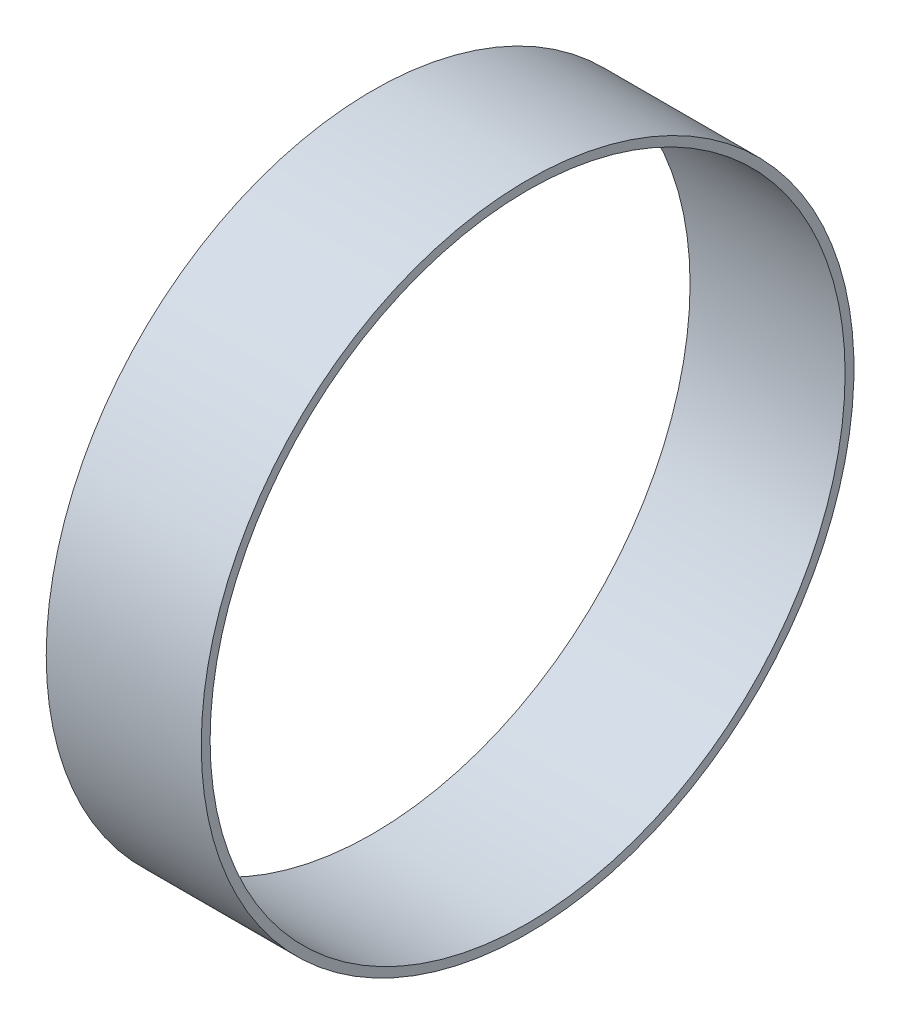
ISO-10303-21;
HEADER;
FILE_DESCRIPTION(('STEP AP214'),'2;1');
FILE_NAME('part.step','',(''),(''),'','','');
FILE_SCHEMA(('AUTOMOTIVE_DESIGN { 1 0 10303 214 1 1 1 1 }'));
ENDSEC;
DATA;
#1=APPLICATION_CONTEXT('core data for automotive mechanical design processes');
#2=APPLICATION_PROTOCOL_DEFINITION('international standard','automotive_design',2000,#1);
#3=PRODUCT_CONTEXT('',#1,'mechanical');
#4=PRODUCT('Part','Part','',(#3));
#5=PRODUCT_RELATED_PRODUCT_CATEGORY('part','',(#4));
#6=PRODUCT_DEFINITION_FORMATION('','',#4);
#7=PRODUCT_DEFINITION_CONTEXT('part definition',#1,'design');
#8=PRODUCT_DEFINITION('design','',#6,#7);
#9=PRODUCT_DEFINITION_SHAPE('','',#8);
#10=(LENGTH_UNIT() NAMED_UNIT(*) SI_UNIT(.MILLI.,.METRE.));
#11=(NAMED_UNIT(*) PLANE_ANGLE_UNIT() SI_UNIT($,.RADIAN.));
#12=(NAMED_UNIT(*) SI_UNIT($,.STERADIAN.) SOLID_ANGLE_UNIT());
#13=UNCERTAINTY_MEASURE_WITH_UNIT(LENGTH_MEASURE(1.E-05),#10,'distance_accuracy_value','');
#14=(GEOMETRIC_REPRESENTATION_CONTEXT(3) GLOBAL_UNCERTAINTY_ASSIGNED_CONTEXT((#13)) GLOBAL_UNIT_ASSIGNED_CONTEXT((#10,
#11,#12)) REPRESENTATION_CONTEXT('',''));
#15=CARTESIAN_POINT('',(0.,0.,0.));
#16=DIRECTION('',(0.,0.,1.));
#17=DIRECTION('',(1.,0.,0.));
#18=AXIS2_PLACEMENT_3D('',#15,#16,#17);
#19=CARTESIAN_POINT('',(0.,0.,0.));
#20=DIRECTION('',(-1.,0.,0.));
#21=DIRECTION('',(0.,0.,1.));
#22=AXIS2_PLACEMENT_3D('',#19,#20,#21);
#23=CYLINDRICAL_SURFACE('',#22,36.84);
#24=CARTESIAN_POINT('',(138.,0.,0.));
#25=DIRECTION('',(-1.,0.,0.));
#26=DIRECTION('',(0.,0.,1.));
#27=AXIS2_PLACEMENT_3D('',#24,#25,#26);
#28=CIRCLE('',#27,36.84);
#29=CARTESIAN_POINT('',(138.,0.,36.84));
#30=VERTEX_POINT('',#29);
#31=EDGE_CURVE('E43',#30,#30,#28,.T.);
#32=ORIENTED_EDGE('',*,*,#31,.T.);
#33=EDGE_LOOP('',(#32));
#34=FACE_BOUND('',#33,.T.);
#35=CARTESIAN_POINT('',(120.5,0.,0.));
#36=DIRECTION('',(-1.,0.,0.));
#37=DIRECTION('',(0.,0.,1.));
#38=AXIS2_PLACEMENT_3D('',#35,#36,#37);
#39=CIRCLE('',#38,36.84);
#40=CARTESIAN_POINT('',(120.5,0.,36.84));
#41=VERTEX_POINT('',#40);
#42=EDGE_CURVE('E10',#41,#41,#39,.T.);
#43=ORIENTED_EDGE('',*,*,#42,.F.);
#44=EDGE_LOOP('',(#43));
#45=FACE_BOUND('',#44,.T.);
#46=ADVANCED_FACE('F29',(#34,#45),#23,.T.);
#47=CARTESIAN_POINT('',(120.5,-36.84,0.));
#48=DIRECTION('',(1.,0.,0.));
#49=DIRECTION('',(0.,0.,-1.));
#50=AXIS2_PLACEMENT_3D('',#47,#48,#49);
#51=PLANE('',#50);
#52=CARTESIAN_POINT('',(120.5,0.,0.));
#53=DIRECTION('',(-1.,0.,0.));
#54=DIRECTION('',(0.,0.,1.));
#55=AXIS2_PLACEMENT_3D('',#52,#53,#54);
#56=CIRCLE('',#55,35.84);
#57=CARTESIAN_POINT('',(120.5,0.,35.84));
#58=VERTEX_POINT('',#57);
#59=EDGE_CURVE('E35',#58,#58,#56,.T.);
#60=ORIENTED_EDGE('',*,*,#59,.F.);
#61=EDGE_LOOP('',(#60));
#62=FACE_BOUND('',#61,.T.);
#63=ORIENTED_EDGE('',*,*,#42,.T.);
#64=EDGE_LOOP('',(#63));
#65=FACE_BOUND('',#64,.T.);
#66=ADVANCED_FACE('F59',(#62,#65),#51,.F.);
#67=CARTESIAN_POINT('',(0.,0.,0.));
#68=DIRECTION('',(-1.,0.,0.));
#69=DIRECTION('',(0.,0.,1.));
#70=AXIS2_PLACEMENT_3D('',#67,#68,#69);
#71=CYLINDRICAL_SURFACE('',#70,35.84);
#72=CARTESIAN_POINT('',(138.,0.,0.));
#73=DIRECTION('',(-1.,0.,0.));
#74=DIRECTION('',(0.,0.,1.));
#75=AXIS2_PLACEMENT_3D('',#72,#73,#74);
#76=CIRCLE('',#75,35.84);
#77=CARTESIAN_POINT('',(138.,0.,35.84));
#78=VERTEX_POINT('',#77);
#79=EDGE_CURVE('E39',#78,#78,#76,.T.);
#80=ORIENTED_EDGE('',*,*,#79,.F.);
#81=EDGE_LOOP('',(#80));
#82=FACE_BOUND('',#81,.T.);
#83=ORIENTED_EDGE('',*,*,#59,.T.);
#84=EDGE_LOOP('',(#83));
#85=FACE_BOUND('',#84,.T.);
#86=ADVANCED_FACE('F54',(#82,#85),#71,.F.);
#87=CARTESIAN_POINT('',(138.,-35.84,0.));
#88=DIRECTION('',(-1.,0.,0.));
#89=DIRECTION('',(0.,0.,1.));
#90=AXIS2_PLACEMENT_3D('',#87,#88,#89);
#91=PLANE('',#90);
#92=ORIENTED_EDGE('',*,*,#31,.F.);
#93=EDGE_LOOP('',(#92));
#94=FACE_BOUND('',#93,.T.);
#95=ORIENTED_EDGE('',*,*,#79,.T.);
#96=EDGE_LOOP('',(#95));
#97=FACE_BOUND('',#96,.T.);
#98=ADVANCED_FACE('F51',(#94,#97),#91,.F.);
#99=CLOSED_SHELL('',(#46,#66,#86,#98));
#100=MANIFOLD_SOLID_BREP('B2',#99);
#101=ADVANCED_BREP_SHAPE_REPRESENTATION('',(#18,#100),#14);
#102=SHAPE_DEFINITION_REPRESENTATION(#9,#101);
ENDSEC;
END-ISO-10303-21;
